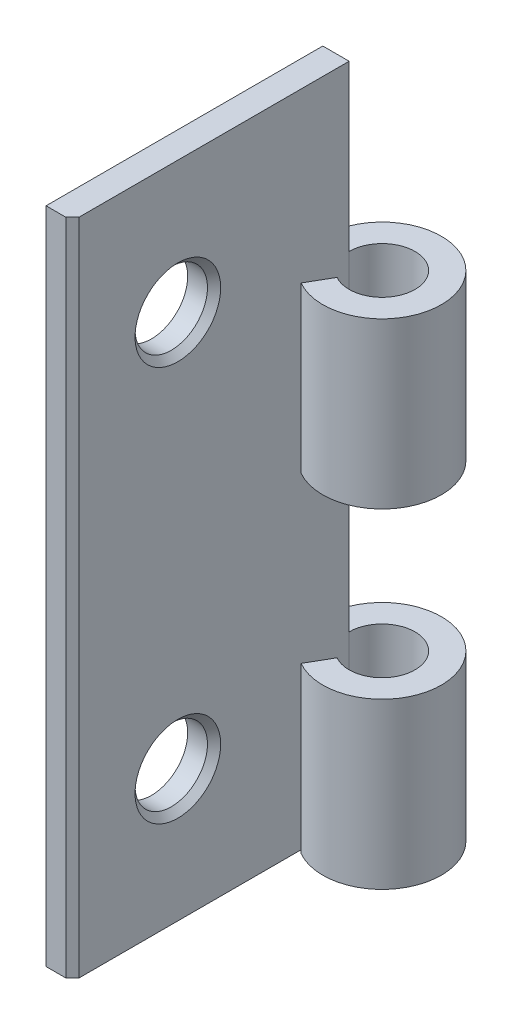
ISO-10303-21;
HEADER;
FILE_DESCRIPTION(('STEP AP214'),'2;1');
FILE_NAME('part.step','',(''),(''),'','','');
FILE_SCHEMA(('AUTOMOTIVE_DESIGN { 1 0 10303 214 1 1 1 1 }'));
ENDSEC;
DATA;
#1=APPLICATION_CONTEXT('core data for automotive mechanical design processes');
#2=APPLICATION_PROTOCOL_DEFINITION('international standard','automotive_design',2000,#1);
#3=PRODUCT_CONTEXT('',#1,'mechanical');
#4=PRODUCT('Part','Part','',(#3));
#5=PRODUCT_RELATED_PRODUCT_CATEGORY('part','',(#4));
#6=PRODUCT_DEFINITION_FORMATION('','',#4);
#7=PRODUCT_DEFINITION_CONTEXT('part definition',#1,'design');
#8=PRODUCT_DEFINITION('design','',#6,#7);
#9=PRODUCT_DEFINITION_SHAPE('','',#8);
#10=(LENGTH_UNIT() NAMED_UNIT(*) SI_UNIT(.MILLI.,.METRE.));
#11=(NAMED_UNIT(*) PLANE_ANGLE_UNIT() SI_UNIT($,.RADIAN.));
#12=(NAMED_UNIT(*) SI_UNIT($,.STERADIAN.) SOLID_ANGLE_UNIT());
#13=UNCERTAINTY_MEASURE_WITH_UNIT(LENGTH_MEASURE(1.E-05),#10,'distance_accuracy_value','');
#14=(GEOMETRIC_REPRESENTATION_CONTEXT(3) GLOBAL_UNCERTAINTY_ASSIGNED_CONTEXT((#13)) GLOBAL_UNIT_ASSIGNED_CONTEXT((#10,
#11,#12)) REPRESENTATION_CONTEXT('',''));
#15=CARTESIAN_POINT('',(0.,0.,0.));
#16=DIRECTION('',(0.,0.,1.));
#17=DIRECTION('',(1.,0.,0.));
#18=AXIS2_PLACEMENT_3D('',#15,#16,#17);
#19=CARTESIAN_POINT('',(2.,25.,-10.5));
#20=DIRECTION('',(0.,0.,1.));
#21=DIRECTION('',(0.,-1.,0.));
#22=AXIS2_PLACEMENT_3D('',#19,#20,#21);
#23=PLANE('',#22);
#24=DIRECTION('',(-1.,0.,0.));
#25=VECTOR('',#24,1.);
#26=CARTESIAN_POINT('',(2.00000000000001,0.,-10.5));
#27=LINE('',#26,#25);
#28=CARTESIAN_POINT('',(2.00000000000001,0.,-10.5));
#29=VERTEX_POINT('',#28);
#30=CARTESIAN_POINT('',(0.,0.,-10.5));
#31=VERTEX_POINT('',#30);
#32=EDGE_CURVE('E130',#29,#31,#27,.T.);
#33=ORIENTED_EDGE('',*,*,#32,.F.);
#34=DIRECTION('',(0.,1.,0.));
#35=VECTOR('',#34,1.);
#36=CARTESIAN_POINT('',(2.,25.,-10.5));
#37=LINE('',#36,#35);
#38=CARTESIAN_POINT('',(2.,-12.5,-10.5));
#39=VERTEX_POINT('',#38);
#40=EDGE_CURVE('E523',#39,#29,#37,.T.);
#41=ORIENTED_EDGE('',*,*,#40,.F.);
#42=DIRECTION('',(-1.,0.,0.));
#43=VECTOR('',#42,1.);
#44=CARTESIAN_POINT('',(2.,-12.5,-10.5));
#45=LINE('',#44,#43);
#46=CARTESIAN_POINT('',(0.,-12.5,-10.5));
#47=VERTEX_POINT('',#46);
#48=EDGE_CURVE('E165',#39,#47,#45,.T.);
#49=ORIENTED_EDGE('',*,*,#48,.T.);
#50=DIRECTION('',(0.,1.,0.));
#51=VECTOR('',#50,1.);
#52=CARTESIAN_POINT('',(0.,25.,-10.5));
#53=LINE('',#52,#51);
#54=EDGE_CURVE('E159',#47,#31,#53,.T.);
#55=ORIENTED_EDGE('',*,*,#54,.T.);
#56=EDGE_LOOP('',(#33,#41,#49,#55));
#57=FACE_BOUND('',#56,.T.);
#58=ADVANCED_FACE('F41',(#57),#23,.F.);
#59=CARTESIAN_POINT('',(2.00000000000001,12.5,-10.5));
#60=VERTEX_POINT('',#59);
#61=CARTESIAN_POINT('',(2.,25.,-10.5));
#62=VERTEX_POINT('',#61);
#63=EDGE_CURVE('E183',#60,#62,#37,.T.);
#64=ORIENTED_EDGE('',*,*,#63,.F.);
#65=DIRECTION('',(-1.,0.,0.));
#66=VECTOR('',#65,1.);
#67=CARTESIAN_POINT('',(2.00000000000001,12.5,-10.5));
#68=LINE('',#67,#66);
#69=CARTESIAN_POINT('',(0.,12.5,-10.5));
#70=VERTEX_POINT('',#69);
#71=EDGE_CURVE('E141',#60,#70,#68,.T.);
#72=ORIENTED_EDGE('',*,*,#71,.T.);
#73=CARTESIAN_POINT('',(0.,25.,-10.5));
#74=VERTEX_POINT('',#73);
#75=EDGE_CURVE('E161',#70,#74,#53,.T.);
#76=ORIENTED_EDGE('',*,*,#75,.T.);
#77=DIRECTION('',(-1.,0.,0.));
#78=VECTOR('',#77,1.);
#79=CARTESIAN_POINT('',(2.,25.,-10.5));
#80=LINE('',#79,#78);
#81=EDGE_CURVE('E190',#62,#74,#80,.T.);
#82=ORIENTED_EDGE('',*,*,#81,.F.);
#83=EDGE_LOOP('',(#64,#72,#76,#82));
#84=FACE_BOUND('',#83,.T.);
#85=ADVANCED_FACE('F227',(#84),#23,.F.);
#86=CARTESIAN_POINT('',(2.,25.,10.5));
#87=DIRECTION('',(0.,-1.,0.));
#88=DIRECTION('',(0.,0.,-1.));
#89=AXIS2_PLACEMENT_3D('',#86,#87,#88);
#90=PLANE('',#89);
#91=DIRECTION('',(-1.,0.,0.));
#92=VECTOR('',#91,1.);
#93=CARTESIAN_POINT('',(2.,25.,10.5));
#94=LINE('',#93,#92);
#95=CARTESIAN_POINT('',(1.5,25.,10.5));
#96=VERTEX_POINT('',#95);
#97=CARTESIAN_POINT('',(0.,25.,10.5));
#98=VERTEX_POINT('',#97);
#99=EDGE_CURVE('E188',#96,#98,#94,.T.);
#100=ORIENTED_EDGE('',*,*,#99,.F.);
#101=DIRECTION('',(0.707106781186548,0.,-0.707106781186548));
#102=VECTOR('',#101,1.);
#103=CARTESIAN_POINT('',(2.,25.,10.));
#104=LINE('',#103,#102);
#105=CARTESIAN_POINT('',(2.,25.,10.));
#106=VERTEX_POINT('',#105);
#107=EDGE_CURVE('E11',#96,#106,#104,.T.);
#108=ORIENTED_EDGE('',*,*,#107,.T.);
#109=DIRECTION('',(0.,0.,1.));
#110=VECTOR('',#109,1.);
#111=CARTESIAN_POINT('',(2.,25.,10.5));
#112=LINE('',#111,#110);
#113=EDGE_CURVE('E522',#62,#106,#112,.T.);
#114=ORIENTED_EDGE('',*,*,#113,.F.);
#115=ORIENTED_EDGE('',*,*,#81,.T.);
#116=DIRECTION('',(0.,0.,1.));
#117=VECTOR('',#116,1.);
#118=CARTESIAN_POINT('',(0.,25.,10.5));
#119=LINE('',#118,#117);
#120=EDGE_CURVE('E169',#74,#98,#119,.T.);
#121=ORIENTED_EDGE('',*,*,#120,.T.);
#122=EDGE_LOOP('',(#100,#108,#114,#115,#121));
#123=FACE_BOUND('',#122,.T.);
#124=ADVANCED_FACE('F232',(#123),#90,.F.);
#125=CARTESIAN_POINT('',(2.,25.,10.5));
#126=DIRECTION('',(0.,0.,-1.));
#127=DIRECTION('',(0.,1.,0.));
#128=AXIS2_PLACEMENT_3D('',#125,#126,#127);
#129=PLANE('',#128);
#130=DIRECTION('',(-1.,0.,0.));
#131=VECTOR('',#130,1.);
#132=CARTESIAN_POINT('',(2.,-25.,10.5));
#133=LINE('',#132,#131);
#134=CARTESIAN_POINT('',(1.5,-25.,10.5));
#135=VERTEX_POINT('',#134);
#136=CARTESIAN_POINT('',(0.,-25.,10.5));
#137=VERTEX_POINT('',#136);
#138=EDGE_CURVE('E186',#135,#137,#133,.T.);
#139=ORIENTED_EDGE('',*,*,#138,.F.);
#140=DIRECTION('',(0.,1.,0.));
#141=VECTOR('',#140,1.);
#142=CARTESIAN_POINT('',(1.5,25.,10.5));
#143=LINE('',#142,#141);
#144=EDGE_CURVE('E50',#135,#96,#143,.T.);
#145=ORIENTED_EDGE('',*,*,#144,.T.);
#146=ORIENTED_EDGE('',*,*,#99,.T.);
#147=DIRECTION('',(0.,-1.,0.));
#148=VECTOR('',#147,1.);
#149=CARTESIAN_POINT('',(0.,25.,10.5));
#150=LINE('',#149,#148);
#151=EDGE_CURVE('E177',#98,#137,#150,.T.);
#152=ORIENTED_EDGE('',*,*,#151,.T.);
#153=EDGE_LOOP('',(#139,#145,#146,#152));
#154=FACE_BOUND('',#153,.T.);
#155=ADVANCED_FACE('F244',(#154),#129,.F.);
#156=CARTESIAN_POINT('',(2.,-25.,10.5));
#157=DIRECTION('',(0.,1.,0.));
#158=DIRECTION('',(0.,0.,1.));
#159=AXIS2_PLACEMENT_3D('',#156,#157,#158);
#160=PLANE('',#159);
#161=DIRECTION('',(0.,0.,-1.));
#162=VECTOR('',#161,1.);
#163=CARTESIAN_POINT('',(2.,-25.,10.5));
#164=LINE('',#163,#162);
#165=CARTESIAN_POINT('',(2.,-25.,9.99999999999999));
#166=VERTEX_POINT('',#165);
#167=CARTESIAN_POINT('',(2.,-25.,-10.5));
#168=VERTEX_POINT('',#167);
#169=EDGE_CURVE('E173',#166,#168,#164,.T.);
#170=ORIENTED_EDGE('',*,*,#169,.F.);
#171=DIRECTION('',(-0.707106781186548,0.,0.707106781186548));
#172=VECTOR('',#171,1.);
#173=CARTESIAN_POINT('',(2.,-25.,9.99999999999999));
#174=LINE('',#173,#172);
#175=EDGE_CURVE('E64',#166,#135,#174,.T.);
#176=ORIENTED_EDGE('',*,*,#175,.T.);
#177=ORIENTED_EDGE('',*,*,#138,.T.);
#178=DIRECTION('',(0.,0.,-1.));
#179=VECTOR('',#178,1.);
#180=CARTESIAN_POINT('',(0.,-25.,10.5));
#181=LINE('',#180,#179);
#182=CARTESIAN_POINT('',(0.,-25.,-10.5));
#183=VERTEX_POINT('',#182);
#184=EDGE_CURVE('E180',#137,#183,#181,.T.);
#185=ORIENTED_EDGE('',*,*,#184,.T.);
#186=DIRECTION('',(-1.,0.,0.));
#187=VECTOR('',#186,1.);
#188=CARTESIAN_POINT('',(2.,-25.,-10.5));
#189=LINE('',#188,#187);
#190=EDGE_CURVE('E184',#168,#183,#189,.T.);
#191=ORIENTED_EDGE('',*,*,#190,.F.);
#192=EDGE_LOOP('',(#170,#176,#177,#185,#191));
#193=FACE_BOUND('',#192,.T.);
#194=ADVANCED_FACE('F248',(#193),#160,.F.);
#195=CARTESIAN_POINT('',(2.,0.,0.));
#196=DIRECTION('',(1.,0.,0.));
#197=DIRECTION('',(0.,0.,-1.));
#198=AXIS2_PLACEMENT_3D('',#195,#196,#197);
#199=PLANE('',#198);
#200=CARTESIAN_POINT('',(2.,-15.,2.5));
#201=DIRECTION('',(1.,0.,0.));
#202=DIRECTION('',(0.,0.,-1.));
#203=AXIS2_PLACEMENT_3D('',#200,#201,#202);
#204=CIRCLE('',#203,3.24999999999999);
#205=CARTESIAN_POINT('',(2.,-15.,-0.749999999999993));
#206=VERTEX_POINT('',#205);
#207=EDGE_CURVE('E202',#206,#206,#204,.F.);
#208=ORIENTED_EDGE('',*,*,#207,.T.);
#209=EDGE_LOOP('',(#208));
#210=FACE_BOUND('',#209,.T.);
#211=CARTESIAN_POINT('',(2.,15.,2.5));
#212=DIRECTION('',(1.,0.,0.));
#213=DIRECTION('',(0.,0.,-1.));
#214=AXIS2_PLACEMENT_3D('',#211,#212,#213);
#215=CIRCLE('',#214,3.24999999999999);
#216=CARTESIAN_POINT('',(2.,15.,-0.749999999999989));
#217=VERTEX_POINT('',#216);
#218=EDGE_CURVE('E199',#217,#217,#215,.F.);
#219=ORIENTED_EDGE('',*,*,#218,.T.);
#220=EDGE_LOOP('',(#219));
#221=FACE_BOUND('',#220,.T.);
#222=ORIENTED_EDGE('',*,*,#113,.T.);
#223=DIRECTION('',(0.,-1.,0.));
#224=VECTOR('',#223,1.);
#225=CARTESIAN_POINT('',(2.,-25.,9.99999999999999));
#226=LINE('',#225,#224);
#227=EDGE_CURVE('E196',#106,#166,#226,.T.);
#228=ORIENTED_EDGE('',*,*,#227,.T.);
#229=ORIENTED_EDGE('',*,*,#169,.T.);
#230=EDGE_CURVE('E520',#168,#39,#37,.T.);
#231=ORIENTED_EDGE('',*,*,#230,.T.);
#232=ORIENTED_EDGE('',*,*,#40,.T.);
#233=DIRECTION('',(0.,1.,0.));
#234=VECTOR('',#233,1.);
#235=CARTESIAN_POINT('',(2.00000000000001,12.5,-10.5));
#236=LINE('',#235,#234);
#237=EDGE_CURVE('E491',#60,#29,#236,.F.);
#238=ORIENTED_EDGE('',*,*,#237,.F.);
#239=ORIENTED_EDGE('',*,*,#63,.T.);
#240=EDGE_LOOP('',(#222,#228,#229,#231,#232,#238,#239));
#241=FACE_BOUND('',#240,.T.);
#242=ADVANCED_FACE('F251',(#210,#221,#241),#199,.T.);
#243=CARTESIAN_POINT('',(0.,0.,0.));
#244=DIRECTION('',(1.,0.,0.));
#245=DIRECTION('',(0.,0.,-1.));
#246=AXIS2_PLACEMENT_3D('',#243,#244,#245);
#247=PLANE('',#246);
#248=CARTESIAN_POINT('',(0.,15.,2.5));
#249=DIRECTION('',(1.,0.,0.));
#250=DIRECTION('',(0.,0.,-1.));
#251=AXIS2_PLACEMENT_3D('',#248,#249,#250);
#252=CIRCLE('',#251,2.74999999999999);
#253=CARTESIAN_POINT('',(0.,15.,-0.249999999999995));
#254=VERTEX_POINT('',#253);
#255=EDGE_CURVE('E480',#254,#254,#252,.T.);
#256=ORIENTED_EDGE('',*,*,#255,.T.);
#257=EDGE_LOOP('',(#256));
#258=FACE_BOUND('',#257,.T.);
#259=CARTESIAN_POINT('',(0.,-15.,2.5));
#260=DIRECTION('',(1.,0.,0.));
#261=DIRECTION('',(0.,0.,-1.));
#262=AXIS2_PLACEMENT_3D('',#259,#260,#261);
#263=CIRCLE('',#262,2.74999999999999);
#264=CARTESIAN_POINT('',(0.,-15.,-0.249999999999998));
#265=VERTEX_POINT('',#264);
#266=EDGE_CURVE('E477',#265,#265,#263,.T.);
#267=ORIENTED_EDGE('',*,*,#266,.T.);
#268=EDGE_LOOP('',(#267));
#269=FACE_BOUND('',#268,.T.);
#270=EDGE_CURVE('E166',#183,#47,#53,.T.);
#271=ORIENTED_EDGE('',*,*,#270,.F.);
#272=ORIENTED_EDGE('',*,*,#184,.F.);
#273=ORIENTED_EDGE('',*,*,#151,.F.);
#274=ORIENTED_EDGE('',*,*,#120,.F.);
#275=ORIENTED_EDGE('',*,*,#75,.F.);
#276=DIRECTION('',(0.,1.,0.));
#277=VECTOR('',#276,1.);
#278=CARTESIAN_POINT('',(0.,12.5,-10.5));
#279=LINE('',#278,#277);
#280=EDGE_CURVE('E149',#70,#31,#279,.F.);
#281=ORIENTED_EDGE('',*,*,#280,.T.);
#282=ORIENTED_EDGE('',*,*,#54,.F.);
#283=EDGE_LOOP('',(#271,#272,#273,#274,#275,#281,#282));
#284=FACE_BOUND('',#283,.T.);
#285=ADVANCED_FACE('F158',(#258,#269,#284),#247,.F.);
#286=CARTESIAN_POINT('',(3.24999999999998,-18.75,-8.33493649053892));
#287=DIRECTION('',(0.866025403784433,0.,0.50000000000001));
#288=DIRECTION('',(0.,1.,0.));
#289=AXIS2_PLACEMENT_3D('',#286,#287,#288);
#290=PLANE('',#289);
#291=DIRECTION('',(-0.50000000000001,0.,0.866025403784433));
#292=VECTOR('',#291,1.);
#293=CARTESIAN_POINT('',(3.24999999999998,-12.5,-8.33493649053892));
#294=LINE('',#293,#292);
#295=CARTESIAN_POINT('',(3.24999999999998,-12.5,-8.33493649053892));
#296=VERTEX_POINT('',#295);
#297=CARTESIAN_POINT('',(2.24999999999996,-12.5,-6.60288568297006));
#298=VERTEX_POINT('',#297);
#299=EDGE_CURVE('E170',#296,#298,#294,.T.);
#300=ORIENTED_EDGE('',*,*,#299,.F.);
#301=DIRECTION('',(0.,1.,0.));
#302=VECTOR('',#301,1.);
#303=CARTESIAN_POINT('',(3.24999999999998,-12.5,-8.33493649053892));
#304=LINE('',#303,#302);
#305=CARTESIAN_POINT('',(3.24999999999998,-25.,-8.33493649053892));
#306=VERTEX_POINT('',#305);
#307=EDGE_CURVE('E498',#306,#296,#304,.T.);
#308=ORIENTED_EDGE('',*,*,#307,.F.);
#309=DIRECTION('',(-0.50000000000001,0.,0.866025403784433));
#310=VECTOR('',#309,1.);
#311=CARTESIAN_POINT('',(3.24999999999998,-25.,-8.33493649053892));
#312=LINE('',#311,#310);
#313=CARTESIAN_POINT('',(2.24999999999996,-25.,-6.60288568297006));
#314=VERTEX_POINT('',#313);
#315=EDGE_CURVE('E516',#306,#314,#312,.T.);
#316=ORIENTED_EDGE('',*,*,#315,.T.);
#317=DIRECTION('',(0.,1.,0.));
#318=VECTOR('',#317,1.);
#319=CARTESIAN_POINT('',(2.24999999999996,-12.5,-6.60288568297006));
#320=LINE('',#319,#318);
#321=EDGE_CURVE('E504',#314,#298,#320,.T.);
#322=ORIENTED_EDGE('',*,*,#321,.T.);
#323=EDGE_LOOP('',(#300,#308,#316,#322));
#324=FACE_BOUND('',#323,.T.);
#325=ADVANCED_FACE('F254',(#324),#290,.F.);
#326=CARTESIAN_POINT('',(4.5,-25.,-10.5));
#327=DIRECTION('',(0.,-1.,0.));
#328=DIRECTION('',(0.,0.,-1.));
#329=AXIS2_PLACEMENT_3D('',#326,#327,#328);
#330=PLANE('',#329);
#331=ORIENTED_EDGE('',*,*,#315,.F.);
#332=CARTESIAN_POINT('',(4.5,-25.,-10.5));
#333=DIRECTION('',(0.,1.,0.));
#334=DIRECTION('',(0.,0.,1.));
#335=AXIS2_PLACEMENT_3D('',#332,#333,#334);
#336=CIRCLE('',#335,2.5);
#337=EDGE_CURVE('E507',#168,#306,#336,.F.);
#338=ORIENTED_EDGE('',*,*,#337,.F.);
#339=ORIENTED_EDGE('',*,*,#190,.T.);
#340=CARTESIAN_POINT('',(4.5,-25.,-10.5));
#341=DIRECTION('',(0.,1.,0.));
#342=DIRECTION('',(0.,0.,1.));
#343=AXIS2_PLACEMENT_3D('',#340,#341,#342);
#344=CIRCLE('',#343,4.5);
#345=EDGE_CURVE('E500',#183,#314,#344,.F.);
#346=ORIENTED_EDGE('',*,*,#345,.T.);
#347=EDGE_LOOP('',(#331,#338,#339,#346));
#348=FACE_BOUND('',#347,.T.);
#349=ADVANCED_FACE('F263',(#348),#330,.T.);
#350=CARTESIAN_POINT('',(4.5,-12.5,-10.5));
#351=DIRECTION('',(0.,-1.,0.));
#352=DIRECTION('',(0.,0.,-1.));
#353=AXIS2_PLACEMENT_3D('',#350,#351,#352);
#354=PLANE('',#353);
#355=CARTESIAN_POINT('',(4.5,-12.5,-10.5));
#356=DIRECTION('',(0.,1.,0.));
#357=DIRECTION('',(0.,0.,1.));
#358=AXIS2_PLACEMENT_3D('',#355,#356,#357);
#359=CIRCLE('',#358,2.5);
#360=EDGE_CURVE('E511',#296,#39,#359,.T.);
#361=ORIENTED_EDGE('',*,*,#360,.F.);
#362=ORIENTED_EDGE('',*,*,#299,.T.);
#363=CARTESIAN_POINT('',(4.5,-12.5,-10.5));
#364=DIRECTION('',(0.,1.,0.));
#365=DIRECTION('',(0.,0.,1.));
#366=AXIS2_PLACEMENT_3D('',#363,#364,#365);
#367=CIRCLE('',#366,4.5);
#368=EDGE_CURVE('E503',#298,#47,#367,.T.);
#369=ORIENTED_EDGE('',*,*,#368,.T.);
#370=ORIENTED_EDGE('',*,*,#48,.F.);
#371=EDGE_LOOP('',(#361,#362,#369,#370));
#372=FACE_BOUND('',#371,.T.);
#373=ADVANCED_FACE('F259',(#372),#354,.F.);
#374=CARTESIAN_POINT('',(4.5,-12.5,-10.5));
#375=DIRECTION('',(0.,1.,0.));
#376=DIRECTION('',(-0.50000000000001,0.,0.866025403784433));
#377=AXIS2_PLACEMENT_3D('',#374,#375,#376);
#378=CYLINDRICAL_SURFACE('',#377,4.5);
#379=ORIENTED_EDGE('',*,*,#270,.T.);
#380=ORIENTED_EDGE('',*,*,#368,.F.);
#381=ORIENTED_EDGE('',*,*,#321,.F.);
#382=ORIENTED_EDGE('',*,*,#345,.F.);
#383=EDGE_LOOP('',(#379,#380,#381,#382));
#384=FACE_BOUND('',#383,.T.);
#385=ADVANCED_FACE('F262',(#384),#378,.T.);
#386=CARTESIAN_POINT('',(4.5,-12.5,-10.5));
#387=DIRECTION('',(0.,1.,0.));
#388=DIRECTION('',(-0.50000000000001,0.,0.866025403784433));
#389=AXIS2_PLACEMENT_3D('',#386,#387,#388);
#390=CYLINDRICAL_SURFACE('',#389,2.5);
#391=ORIENTED_EDGE('',*,*,#230,.F.);
#392=ORIENTED_EDGE('',*,*,#337,.T.);
#393=ORIENTED_EDGE('',*,*,#307,.T.);
#394=ORIENTED_EDGE('',*,*,#360,.T.);
#395=EDGE_LOOP('',(#391,#392,#393,#394));
#396=FACE_BOUND('',#395,.T.);
#397=ADVANCED_FACE('F271',(#396),#390,.F.);
#398=CARTESIAN_POINT('',(3.24999999999998,6.24999999999999,-8.33493649053892));
#399=DIRECTION('',(0.866025403784433,0.,0.50000000000001));
#400=DIRECTION('',(0.,1.,0.));
#401=AXIS2_PLACEMENT_3D('',#398,#399,#400);
#402=PLANE('',#401);
#403=DIRECTION('',(-0.50000000000001,0.,0.866025403784433));
#404=VECTOR('',#403,1.);
#405=CARTESIAN_POINT('',(3.24999999999998,12.5,-8.33493649053892));
#406=LINE('',#405,#404);
#407=CARTESIAN_POINT('',(3.24999999999998,12.5,-8.33493649053892));
#408=VERTEX_POINT('',#407);
#409=CARTESIAN_POINT('',(2.24999999999996,12.5,-6.60288568297005));
#410=VERTEX_POINT('',#409);
#411=EDGE_CURVE('E496',#408,#410,#406,.T.);
#412=ORIENTED_EDGE('',*,*,#411,.F.);
#413=DIRECTION('',(0.,1.,0.));
#414=VECTOR('',#413,1.);
#415=CARTESIAN_POINT('',(3.24999999999998,12.5,-8.33493649053892));
#416=LINE('',#415,#414);
#417=CARTESIAN_POINT('',(3.24999999999998,0.,-8.33493649053892));
#418=VERTEX_POINT('',#417);
#419=EDGE_CURVE('E479',#418,#408,#416,.T.);
#420=ORIENTED_EDGE('',*,*,#419,.F.);
#421=DIRECTION('',(-0.50000000000001,0.,0.866025403784433));
#422=VECTOR('',#421,1.);
#423=CARTESIAN_POINT('',(3.24999999999998,0.,-8.33493649053892));
#424=LINE('',#423,#422);
#425=CARTESIAN_POINT('',(2.24999999999996,0.,-6.60288568297005));
#426=VERTEX_POINT('',#425);
#427=EDGE_CURVE('E140',#418,#426,#424,.T.);
#428=ORIENTED_EDGE('',*,*,#427,.T.);
#429=DIRECTION('',(0.,1.,0.));
#430=VECTOR('',#429,1.);
#431=CARTESIAN_POINT('',(2.24999999999996,12.5,-6.60288568297005));
#432=LINE('',#431,#430);
#433=EDGE_CURVE('E152',#426,#410,#432,.T.);
#434=ORIENTED_EDGE('',*,*,#433,.T.);
#435=EDGE_LOOP('',(#412,#420,#428,#434));
#436=FACE_BOUND('',#435,.T.);
#437=ADVANCED_FACE('F274',(#436),#402,.F.);
#438=CARTESIAN_POINT('',(4.5,0.,-10.5));
#439=DIRECTION('',(0.,-1.,0.));
#440=DIRECTION('',(0.,0.,-1.));
#441=AXIS2_PLACEMENT_3D('',#438,#439,#440);
#442=PLANE('',#441);
#443=ORIENTED_EDGE('',*,*,#427,.F.);
#444=CARTESIAN_POINT('',(4.5,0.,-10.5));
#445=DIRECTION('',(0.,1.,0.));
#446=DIRECTION('',(0.,0.,1.));
#447=AXIS2_PLACEMENT_3D('',#444,#445,#446);
#448=CIRCLE('',#447,2.5);
#449=EDGE_CURVE('E135',#29,#418,#448,.F.);
#450=ORIENTED_EDGE('',*,*,#449,.F.);
#451=ORIENTED_EDGE('',*,*,#32,.T.);
#452=CARTESIAN_POINT('',(4.5,0.,-10.5));
#453=DIRECTION('',(0.,1.,0.));
#454=DIRECTION('',(0.,0.,1.));
#455=AXIS2_PLACEMENT_3D('',#452,#453,#454);
#456=CIRCLE('',#455,4.5);
#457=EDGE_CURVE('E133',#31,#426,#456,.F.);
#458=ORIENTED_EDGE('',*,*,#457,.T.);
#459=EDGE_LOOP('',(#443,#450,#451,#458));
#460=FACE_BOUND('',#459,.T.);
#461=ADVANCED_FACE('F132',(#460),#442,.T.);
#462=CARTESIAN_POINT('',(4.5,12.5,-10.5));
#463=DIRECTION('',(0.,-1.,0.));
#464=DIRECTION('',(0.,0.,-1.));
#465=AXIS2_PLACEMENT_3D('',#462,#463,#464);
#466=PLANE('',#465);
#467=CARTESIAN_POINT('',(4.5,12.5,-10.5));
#468=DIRECTION('',(0.,1.,0.));
#469=DIRECTION('',(0.,0.,1.));
#470=AXIS2_PLACEMENT_3D('',#467,#468,#469);
#471=CIRCLE('',#470,2.5);
#472=EDGE_CURVE('E483',#408,#60,#471,.T.);
#473=ORIENTED_EDGE('',*,*,#472,.F.);
#474=ORIENTED_EDGE('',*,*,#411,.T.);
#475=CARTESIAN_POINT('',(4.5,12.5,-10.5));
#476=DIRECTION('',(0.,1.,0.));
#477=DIRECTION('',(0.,0.,1.));
#478=AXIS2_PLACEMENT_3D('',#475,#476,#477);
#479=CIRCLE('',#478,4.5);
#480=EDGE_CURVE('E162',#410,#70,#479,.T.);
#481=ORIENTED_EDGE('',*,*,#480,.T.);
#482=ORIENTED_EDGE('',*,*,#71,.F.);
#483=EDGE_LOOP('',(#473,#474,#481,#482));
#484=FACE_BOUND('',#483,.T.);
#485=ADVANCED_FACE('F279',(#484),#466,.F.);
#486=CARTESIAN_POINT('',(4.5,12.5,-10.5));
#487=DIRECTION('',(0.,1.,0.));
#488=DIRECTION('',(-0.50000000000001,0.,0.866025403784433));
#489=AXIS2_PLACEMENT_3D('',#486,#487,#488);
#490=CYLINDRICAL_SURFACE('',#489,4.5);
#491=ORIENTED_EDGE('',*,*,#280,.F.);
#492=ORIENTED_EDGE('',*,*,#480,.F.);
#493=ORIENTED_EDGE('',*,*,#433,.F.);
#494=ORIENTED_EDGE('',*,*,#457,.F.);
#495=EDGE_LOOP('',(#491,#492,#493,#494));
#496=FACE_BOUND('',#495,.T.);
#497=ADVANCED_FACE('F147',(#496),#490,.T.);
#498=CARTESIAN_POINT('',(4.5,12.5,-10.5));
#499=DIRECTION('',(0.,1.,0.));
#500=DIRECTION('',(-0.50000000000001,0.,0.866025403784433));
#501=AXIS2_PLACEMENT_3D('',#498,#499,#500);
#502=CYLINDRICAL_SURFACE('',#501,2.5);
#503=ORIENTED_EDGE('',*,*,#237,.T.);
#504=ORIENTED_EDGE('',*,*,#449,.T.);
#505=ORIENTED_EDGE('',*,*,#419,.T.);
#506=ORIENTED_EDGE('',*,*,#472,.T.);
#507=EDGE_LOOP('',(#503,#504,#505,#506));
#508=FACE_BOUND('',#507,.T.);
#509=ADVANCED_FACE('F288',(#508),#502,.F.);
#510=CARTESIAN_POINT('',(2.,-15.,2.5));
#511=DIRECTION('',(1.,0.,0.));
#512=DIRECTION('',(0.,0.,-1.));
#513=AXIS2_PLACEMENT_3D('',#510,#511,#512);
#514=CYLINDRICAL_SURFACE('',#513,2.74999999999999);
#515=CARTESIAN_POINT('',(1.5,-15.,2.5));
#516=DIRECTION('',(1.,0.,0.));
#517=DIRECTION('',(0.,0.,-1.));
#518=AXIS2_PLACEMENT_3D('',#515,#516,#517);
#519=CIRCLE('',#518,2.74999999999999);
#520=CARTESIAN_POINT('',(1.5,-15.,-0.249999999999998));
#521=VERTEX_POINT('',#520);
#522=EDGE_CURVE('E193',#521,#521,#519,.T.);
#523=ORIENTED_EDGE('',*,*,#522,.T.);
#524=EDGE_LOOP('',(#523));
#525=FACE_BOUND('',#524,.T.);
#526=ORIENTED_EDGE('',*,*,#266,.F.);
#527=EDGE_LOOP('',(#526));
#528=FACE_BOUND('',#527,.T.);
#529=ADVANCED_FACE('F291',(#525,#528),#514,.F.);
#530=CARTESIAN_POINT('',(2.,15.,2.5));
#531=DIRECTION('',(1.,0.,0.));
#532=DIRECTION('',(0.,0.,-1.));
#533=AXIS2_PLACEMENT_3D('',#530,#531,#532);
#534=CYLINDRICAL_SURFACE('',#533,2.74999999999999);
#535=CARTESIAN_POINT('',(1.5,15.,2.5));
#536=DIRECTION('',(1.,0.,0.));
#537=DIRECTION('',(0.,0.,-1.));
#538=AXIS2_PLACEMENT_3D('',#535,#536,#537);
#539=CIRCLE('',#538,2.74999999999999);
#540=CARTESIAN_POINT('',(1.5,15.,-0.249999999999995));
#541=VERTEX_POINT('',#540);
#542=EDGE_CURVE('E205',#541,#541,#539,.T.);
#543=ORIENTED_EDGE('',*,*,#542,.T.);
#544=EDGE_LOOP('',(#543));
#545=FACE_BOUND('',#544,.T.);
#546=ORIENTED_EDGE('',*,*,#255,.F.);
#547=EDGE_LOOP('',(#546));
#548=FACE_BOUND('',#547,.T.);
#549=ADVANCED_FACE('F210',(#545,#548),#534,.F.);
#550=CARTESIAN_POINT('',(1.5,-15.,2.5));
#551=DIRECTION('',(1.,0.,0.));
#552=DIRECTION('',(0.,0.,-1.));
#553=AXIS2_PLACEMENT_3D('',#550,#551,#552);
#554=CONICAL_SURFACE('',#553,2.74999999999999,0.785398163397445);
#555=ORIENTED_EDGE('',*,*,#207,.F.);
#556=EDGE_LOOP('',(#555));
#557=FACE_BOUND('',#556,.T.);
#558=ORIENTED_EDGE('',*,*,#522,.F.);
#559=EDGE_LOOP('',(#558));
#560=FACE_BOUND('',#559,.T.);
#561=ADVANCED_FACE('F215',(#557,#560),#554,.F.);
#562=CARTESIAN_POINT('',(1.5,15.,2.5));
#563=DIRECTION('',(1.,0.,0.));
#564=DIRECTION('',(0.,0.,-1.));
#565=AXIS2_PLACEMENT_3D('',#562,#563,#564);
#566=CONICAL_SURFACE('',#565,2.74999999999999,0.785398163397445);
#567=ORIENTED_EDGE('',*,*,#218,.F.);
#568=EDGE_LOOP('',(#567));
#569=FACE_BOUND('',#568,.T.);
#570=ORIENTED_EDGE('',*,*,#542,.F.);
#571=EDGE_LOOP('',(#570));
#572=FACE_BOUND('',#571,.T.);
#573=ADVANCED_FACE('F213',(#569,#572),#566,.F.);
#574=CARTESIAN_POINT('',(2.,0.,10.));
#575=DIRECTION('',(0.707106781186547,0.,0.707106781186547));
#576=DIRECTION('',(0.,1.,0.));
#577=AXIS2_PLACEMENT_3D('',#574,#575,#576);
#578=PLANE('',#577);
#579=ORIENTED_EDGE('',*,*,#107,.F.);
#580=ORIENTED_EDGE('',*,*,#144,.F.);
#581=ORIENTED_EDGE('',*,*,#175,.F.);
#582=ORIENTED_EDGE('',*,*,#227,.F.);
#583=EDGE_LOOP('',(#579,#580,#581,#582));
#584=FACE_BOUND('',#583,.T.);
#585=ADVANCED_FACE('F44',(#584),#578,.T.);
#586=CLOSED_SHELL('',(#58,#85,#124,#155,#194,#242,#285,#325,#349,#373,#385,#397,#437,#461,#485,
#497,#509,#529,#549,#561,#573,#585));
#587=MANIFOLD_SOLID_BREP('B2',#586);
#588=ADVANCED_BREP_SHAPE_REPRESENTATION('',(#18,#587),#14);
#589=SHAPE_DEFINITION_REPRESENTATION(#9,#588);
ENDSEC;
END-ISO-10303-21;
